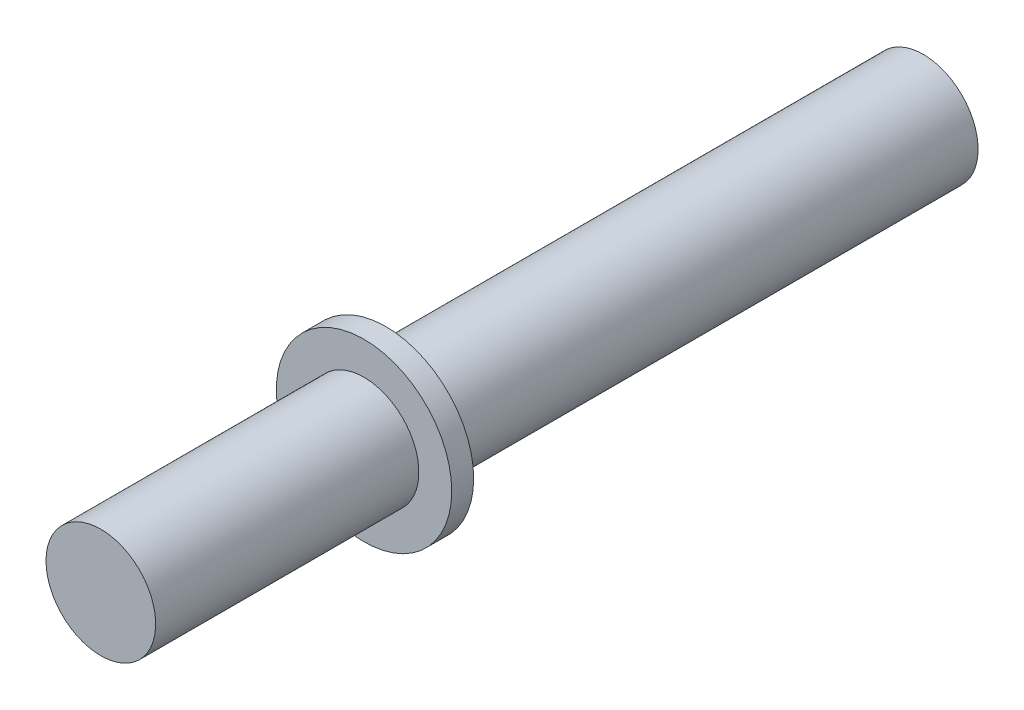
ISO-10303-21;
HEADER;
FILE_DESCRIPTION(('STEP AP214'),'2;1');
FILE_NAME('part.step','',(''),(''),'','','');
FILE_SCHEMA(('AUTOMOTIVE_DESIGN { 1 0 10303 214 1 1 1 1 }'));
ENDSEC;
DATA;
#1=APPLICATION_CONTEXT('core data for automotive mechanical design processes');
#2=APPLICATION_PROTOCOL_DEFINITION('international standard','automotive_design',2000,#1);
#3=PRODUCT_CONTEXT('',#1,'mechanical');
#4=PRODUCT('Part','Part','',(#3));
#5=PRODUCT_RELATED_PRODUCT_CATEGORY('part','',(#4));
#6=PRODUCT_DEFINITION_FORMATION('','',#4);
#7=PRODUCT_DEFINITION_CONTEXT('part definition',#1,'design');
#8=PRODUCT_DEFINITION('design','',#6,#7);
#9=PRODUCT_DEFINITION_SHAPE('','',#8);
#10=(LENGTH_UNIT() NAMED_UNIT(*) SI_UNIT(.MILLI.,.METRE.));
#11=(NAMED_UNIT(*) PLANE_ANGLE_UNIT() SI_UNIT($,.RADIAN.));
#12=(NAMED_UNIT(*) SI_UNIT($,.STERADIAN.) SOLID_ANGLE_UNIT());
#13=UNCERTAINTY_MEASURE_WITH_UNIT(LENGTH_MEASURE(1.E-05),#10,'distance_accuracy_value','');
#14=(GEOMETRIC_REPRESENTATION_CONTEXT(3) GLOBAL_UNCERTAINTY_ASSIGNED_CONTEXT((#13)) GLOBAL_UNIT_ASSIGNED_CONTEXT((#10,
#11,#12)) REPRESENTATION_CONTEXT('',''));
#15=CARTESIAN_POINT('',(0.,0.,0.));
#16=DIRECTION('',(0.,0.,1.));
#17=DIRECTION('',(1.,0.,0.));
#18=AXIS2_PLACEMENT_3D('',#15,#16,#17);
#19=CARTESIAN_POINT('',(-32.018684277368,-34.6434023405005,44.));
#20=DIRECTION('',(0.,0.,-1.));
#21=DIRECTION('',(-1.,0.,0.));
#22=AXIS2_PLACEMENT_3D('',#19,#20,#21);
#23=CYLINDRICAL_SURFACE('',#22,1.5);
#24=CARTESIAN_POINT('',(-32.018684277368,-34.6434023405005,36.8));
#25=DIRECTION('',(0.,0.,1.));
#26=DIRECTION('',(1.,0.,0.));
#27=AXIS2_PLACEMENT_3D('',#24,#25,#26);
#28=CIRCLE('',#27,1.5);
#29=CARTESIAN_POINT('',(-33.518684277368,-34.6434023405005,36.8));
#30=VERTEX_POINT('',#29);
#31=EDGE_CURVE('E39',#30,#30,#28,.T.);
#32=CARTESIAN_POINT('',(-32.018684277368,-34.6434023405005,44.));
#33=DIRECTION('',(0.,0.,1.));
#34=DIRECTION('',(1.,0.,0.));
#35=AXIS2_PLACEMENT_3D('',#32,#33,#34);
#36=CIRCLE('',#35,1.5);
#37=CARTESIAN_POINT('',(-33.518684277368,-34.6434023405005,44.));
#38=VERTEX_POINT('',#37);
#39=EDGE_CURVE('E43',#38,#38,#36,.T.);
#40=CARTESIAN_POINT('',(-33.518684277368,-34.6434023405005,36.8));
#41=CARTESIAN_POINT('',(-33.518684277368,-34.6434023405005,36.875));
#42=CARTESIAN_POINT('',(-33.518684277368,-34.6434023405005,36.95));
#43=CARTESIAN_POINT('',(-33.518684277368,-34.6434023405005,37.1));
#44=CARTESIAN_POINT('',(-33.518684277368,-34.6434023405005,37.175));
#45=CARTESIAN_POINT('',(-33.518684277368,-34.6434023405005,37.325));
#46=CARTESIAN_POINT('',(-33.518684277368,-34.6434023405005,37.4));
#47=CARTESIAN_POINT('',(-33.518684277368,-34.6434023405005,37.55));
#48=CARTESIAN_POINT('',(-33.518684277368,-34.6434023405005,37.625));
#49=CARTESIAN_POINT('',(-33.518684277368,-34.6434023405005,37.775));
#50=CARTESIAN_POINT('',(-33.518684277368,-34.6434023405005,37.85));
#51=CARTESIAN_POINT('',(-33.518684277368,-34.6434023405005,38.));
#52=CARTESIAN_POINT('',(-33.518684277368,-34.6434023405005,38.075));
#53=CARTESIAN_POINT('',(-33.518684277368,-34.6434023405005,38.225));
#54=CARTESIAN_POINT('',(-33.518684277368,-34.6434023405005,38.3));
#55=CARTESIAN_POINT('',(-33.518684277368,-34.6434023405005,38.45));
#56=CARTESIAN_POINT('',(-33.518684277368,-34.6434023405005,38.525));
#57=CARTESIAN_POINT('',(-33.518684277368,-34.6434023405005,38.675));
#58=CARTESIAN_POINT('',(-33.518684277368,-34.6434023405005,38.75));
#59=CARTESIAN_POINT('',(-33.518684277368,-34.6434023405005,38.9));
#60=CARTESIAN_POINT('',(-33.518684277368,-34.6434023405005,38.975));
#61=CARTESIAN_POINT('',(-33.518684277368,-34.6434023405005,39.125));
#62=CARTESIAN_POINT('',(-33.518684277368,-34.6434023405005,39.2));
#63=CARTESIAN_POINT('',(-33.518684277368,-34.6434023405005,39.35));
#64=CARTESIAN_POINT('',(-33.518684277368,-34.6434023405005,39.425));
#65=CARTESIAN_POINT('',(-33.518684277368,-34.6434023405005,39.575));
#66=CARTESIAN_POINT('',(-33.518684277368,-34.6434023405005,39.65));
#67=CARTESIAN_POINT('',(-33.518684277368,-34.6434023405005,39.8));
#68=CARTESIAN_POINT('',(-33.518684277368,-34.6434023405005,39.875));
#69=CARTESIAN_POINT('',(-33.518684277368,-34.6434023405005,40.025));
#70=CARTESIAN_POINT('',(-33.518684277368,-34.6434023405005,40.1));
#71=CARTESIAN_POINT('',(-33.518684277368,-34.6434023405005,40.25));
#72=CARTESIAN_POINT('',(-33.518684277368,-34.6434023405005,40.325));
#73=CARTESIAN_POINT('',(-33.518684277368,-34.6434023405005,40.475));
#74=CARTESIAN_POINT('',(-33.518684277368,-34.6434023405005,40.55));
#75=CARTESIAN_POINT('',(-33.518684277368,-34.6434023405005,40.7));
#76=CARTESIAN_POINT('',(-33.518684277368,-34.6434023405005,40.775));
#77=CARTESIAN_POINT('',(-33.518684277368,-34.6434023405005,40.925));
#78=CARTESIAN_POINT('',(-33.518684277368,-34.6434023405005,41.));
#79=CARTESIAN_POINT('',(-33.518684277368,-34.6434023405005,41.15));
#80=CARTESIAN_POINT('',(-33.518684277368,-34.6434023405005,41.225));
#81=CARTESIAN_POINT('',(-33.518684277368,-34.6434023405005,41.375));
#82=CARTESIAN_POINT('',(-33.518684277368,-34.6434023405005,41.45));
#83=CARTESIAN_POINT('',(-33.518684277368,-34.6434023405005,41.6));
#84=CARTESIAN_POINT('',(-33.518684277368,-34.6434023405005,41.675));
#85=CARTESIAN_POINT('',(-33.518684277368,-34.6434023405005,41.825));
#86=CARTESIAN_POINT('',(-33.518684277368,-34.6434023405005,41.9));
#87=CARTESIAN_POINT('',(-33.518684277368,-34.6434023405005,42.05));
#88=CARTESIAN_POINT('',(-33.518684277368,-34.6434023405005,42.125));
#89=CARTESIAN_POINT('',(-33.518684277368,-34.6434023405005,42.275));
#90=CARTESIAN_POINT('',(-33.518684277368,-34.6434023405005,42.35));
#91=CARTESIAN_POINT('',(-33.518684277368,-34.6434023405005,42.5));
#92=CARTESIAN_POINT('',(-33.518684277368,-34.6434023405005,42.575));
#93=CARTESIAN_POINT('',(-33.518684277368,-34.6434023405005,42.725));
#94=CARTESIAN_POINT('',(-33.518684277368,-34.6434023405005,42.8));
#95=CARTESIAN_POINT('',(-33.518684277368,-34.6434023405005,42.95));
#96=CARTESIAN_POINT('',(-33.518684277368,-34.6434023405005,43.025));
#97=CARTESIAN_POINT('',(-33.518684277368,-34.6434023405005,43.175));
#98=CARTESIAN_POINT('',(-33.518684277368,-34.6434023405005,43.25));
#99=CARTESIAN_POINT('',(-33.518684277368,-34.6434023405005,43.4));
#100=CARTESIAN_POINT('',(-33.518684277368,-34.6434023405005,43.475));
#101=CARTESIAN_POINT('',(-33.518684277368,-34.6434023405005,43.625));
#102=CARTESIAN_POINT('',(-33.518684277368,-34.6434023405005,43.7));
#103=CARTESIAN_POINT('',(-33.518684277368,-34.6434023405005,43.85));
#104=CARTESIAN_POINT('',(-33.518684277368,-34.6434023405005,43.925));
#105=CARTESIAN_POINT('',(-33.518684277368,-34.6434023405005,44.));
#106=B_SPLINE_CURVE_WITH_KNOTS('',3,(#40,#41,#42,#43,#44,#45,#46,#47,#48,#49,#50,#51,#52,#53,
#54,#55,#56,#57,#58,#59,#60,#61,#62,#63,#64,#65,#66,#67,#68,#69,#70,#71,#72,#73,#74,#75,#76,#77,
#78,#79,#80,#81,#82,#83,#84,#85,#86,#87,#88,#89,#90,#91,#92,#93,#94,#95,#96,#97,#98,#99,#100,
#101,#102,#103,#104,#105),.UNSPECIFIED.,.F.,.F.,(4,2,2,2,2,2,2,2,2,2,2,2,2,2,2,2,2,2,2,2,2,2,2,
2,2,2,2,2,2,2,2,2,4),(0.,0.224999999999996,0.449999999999999,0.674999999999995,
0.899999999999998,1.12499999999999,1.35,1.57499999999999,1.8,2.02499999999999,2.25,2.475,
2.69999999999999,2.92499999999999,3.14999999999999,3.375,3.59999999999999,3.82499999999999,
4.04999999999999,4.27499999999999,4.49999999999999,4.72499999999999,4.94999999999999,
5.17499999999999,5.39999999999999,5.62499999999999,5.84999999999999,6.07499999999999,
6.29999999999999,6.52499999999999,6.74999999999999,6.97499999999999,7.19999999999999),.UNSPECIFIED.);
#107=EDGE_CURVE('BSEAM36',#30,#38,#106,.T.);
#108=ORIENTED_EDGE('',*,*,#31,.T.);
#109=ORIENTED_EDGE('',*,*,#39,.F.);
#110=ORIENTED_EDGE('',*,*,#107,.T.);
#111=ORIENTED_EDGE('',*,*,#107,.F.);
#112=EDGE_LOOP('',(#108,#110,#109,#111));
#113=FACE_BOUND('',#112,.T.);
#114=ADVANCED_FACE('F36',(#113),#23,.T.);
#115=CARTESIAN_POINT('',(-32.018684277368,-34.6434023405005,44.));
#116=DIRECTION('',(0.,0.,1.));
#117=DIRECTION('',(1.,0.,0.));
#118=AXIS2_PLACEMENT_3D('',#115,#116,#117);
#119=PLANE('',#118);
#120=ORIENTED_EDGE('',*,*,#39,.T.);
#121=EDGE_LOOP('',(#120));
#122=FACE_BOUND('',#121,.T.);
#123=ADVANCED_FACE('F75',(#122),#119,.T.);
#124=CARTESIAN_POINT('',(-32.018684277368,-34.6434023405005,36.8));
#125=DIRECTION('',(0.,0.,-1.));
#126=DIRECTION('',(-1.,0.,0.));
#127=AXIS2_PLACEMENT_3D('',#124,#125,#126);
#128=CYLINDRICAL_SURFACE('',#127,2.4);
#129=CARTESIAN_POINT('',(-32.018684277368,-34.6434023405005,36.8));
#130=DIRECTION('',(0.,0.,1.));
#131=DIRECTION('',(1.,0.,0.));
#132=AXIS2_PLACEMENT_3D('',#129,#130,#131);
#133=CIRCLE('',#132,2.4);
#134=CARTESIAN_POINT('',(-29.618684277368,-34.6434023405005,36.8));
#135=VERTEX_POINT('',#134);
#136=EDGE_CURVE('E55',#135,#135,#133,.T.);
#137=ORIENTED_EDGE('',*,*,#136,.F.);
#138=EDGE_LOOP('',(#137));
#139=FACE_BOUND('',#138,.T.);
#140=CARTESIAN_POINT('',(-32.018684277368,-34.6434023405005,36.2));
#141=DIRECTION('',(0.,0.,1.));
#142=DIRECTION('',(1.,0.,0.));
#143=AXIS2_PLACEMENT_3D('',#140,#141,#142);
#144=CIRCLE('',#143,2.4);
#145=CARTESIAN_POINT('',(-29.618684277368,-34.6434023405005,36.2));
#146=VERTEX_POINT('',#145);
#147=EDGE_CURVE('E52',#146,#146,#144,.T.);
#148=ORIENTED_EDGE('',*,*,#147,.T.);
#149=EDGE_LOOP('',(#148));
#150=FACE_BOUND('',#149,.T.);
#151=ADVANCED_FACE('F67',(#139,#150),#128,.T.);
#152=CARTESIAN_POINT('',(-32.018684277368,-34.6434023405005,36.8));
#153=DIRECTION('',(0.,0.,1.));
#154=DIRECTION('',(1.,0.,0.));
#155=AXIS2_PLACEMENT_3D('',#152,#153,#154);
#156=PLANE('',#155);
#157=ORIENTED_EDGE('',*,*,#31,.F.);
#158=EDGE_LOOP('',(#157));
#159=FACE_BOUND('',#158,.T.);
#160=ORIENTED_EDGE('',*,*,#136,.T.);
#161=EDGE_LOOP('',(#160));
#162=FACE_BOUND('',#161,.T.);
#163=ADVANCED_FACE('F64',(#159,#162),#156,.T.);
#164=CARTESIAN_POINT('',(-32.018684277368,-34.6434023405005,36.2));
#165=DIRECTION('',(0.,0.,1.));
#166=DIRECTION('',(1.,0.,0.));
#167=AXIS2_PLACEMENT_3D('',#164,#165,#166);
#168=PLANE('',#167);
#169=CARTESIAN_POINT('',(-32.018684277368,-34.6434023405005,36.2));
#170=DIRECTION('',(0.,0.,1.));
#171=DIRECTION('',(1.,0.,0.));
#172=AXIS2_PLACEMENT_3D('',#169,#170,#171);
#173=CIRCLE('',#172,1.5);
#174=CARTESIAN_POINT('',(-33.518684277368,-34.6434023405005,36.2));
#175=VERTEX_POINT('',#174);
#176=EDGE_CURVE('E10',#175,#175,#173,.T.);
#177=ORIENTED_EDGE('',*,*,#176,.T.);
#178=EDGE_LOOP('',(#177));
#179=FACE_BOUND('',#178,.T.);
#180=ORIENTED_EDGE('',*,*,#147,.F.);
#181=EDGE_LOOP('',(#180));
#182=FACE_BOUND('',#181,.T.);
#183=ADVANCED_FACE('F66',(#179,#182),#168,.F.);
#184=CARTESIAN_POINT('',(-32.018684277368,-34.6434023405005,21.5));
#185=DIRECTION('',(0.,0.,1.));
#186=DIRECTION('',(1.,0.,0.));
#187=AXIS2_PLACEMENT_3D('',#184,#185,#186);
#188=PLANE('',#187);
#189=CARTESIAN_POINT('',(-32.018684277368,-34.6434023405005,21.5));
#190=DIRECTION('',(0.,0.,1.));
#191=DIRECTION('',(1.,0.,0.));
#192=AXIS2_PLACEMENT_3D('',#189,#190,#191);
#193=CIRCLE('',#192,1.5);
#194=CARTESIAN_POINT('',(-33.518684277368,-34.6434023405005,21.5));
#195=VERTEX_POINT('',#194);
#196=EDGE_CURVE('E47',#195,#195,#193,.T.);
#197=ORIENTED_EDGE('',*,*,#196,.F.);
#198=EDGE_LOOP('',(#197));
#199=FACE_BOUND('',#198,.T.);
#200=ADVANCED_FACE('F73',(#199),#188,.F.);
#201=CARTESIAN_POINT('',(-33.518684277368,-34.6434023405005,21.5));
#202=CARTESIAN_POINT('',(-33.518684277368,-34.6434023405005,21.653125));
#203=CARTESIAN_POINT('',(-33.518684277368,-34.6434023405005,21.80625));
#204=CARTESIAN_POINT('',(-33.518684277368,-34.6434023405005,22.1125));
#205=CARTESIAN_POINT('',(-33.518684277368,-34.6434023405005,22.265625));
#206=CARTESIAN_POINT('',(-33.518684277368,-34.6434023405005,22.571875));
#207=CARTESIAN_POINT('',(-33.518684277368,-34.6434023405005,22.725));
#208=CARTESIAN_POINT('',(-33.518684277368,-34.6434023405005,23.03125));
#209=CARTESIAN_POINT('',(-33.518684277368,-34.6434023405005,23.184375));
#210=CARTESIAN_POINT('',(-33.518684277368,-34.6434023405005,23.490625));
#211=CARTESIAN_POINT('',(-33.518684277368,-34.6434023405005,23.64375));
#212=CARTESIAN_POINT('',(-33.518684277368,-34.6434023405005,23.95));
#213=CARTESIAN_POINT('',(-33.518684277368,-34.6434023405005,24.103125));
#214=CARTESIAN_POINT('',(-33.518684277368,-34.6434023405005,24.409375));
#215=CARTESIAN_POINT('',(-33.518684277368,-34.6434023405005,24.5625));
#216=CARTESIAN_POINT('',(-33.518684277368,-34.6434023405005,24.86875));
#217=CARTESIAN_POINT('',(-33.518684277368,-34.6434023405005,25.021875));
#218=CARTESIAN_POINT('',(-33.518684277368,-34.6434023405005,25.328125));
#219=CARTESIAN_POINT('',(-33.518684277368,-34.6434023405005,25.48125));
#220=CARTESIAN_POINT('',(-33.518684277368,-34.6434023405005,25.7875));
#221=CARTESIAN_POINT('',(-33.518684277368,-34.6434023405005,25.940625));
#222=CARTESIAN_POINT('',(-33.518684277368,-34.6434023405005,26.246875));
#223=CARTESIAN_POINT('',(-33.518684277368,-34.6434023405005,26.4));
#224=CARTESIAN_POINT('',(-33.518684277368,-34.6434023405005,26.70625));
#225=CARTESIAN_POINT('',(-33.518684277368,-34.6434023405005,26.859375));
#226=CARTESIAN_POINT('',(-33.518684277368,-34.6434023405005,27.165625));
#227=CARTESIAN_POINT('',(-33.518684277368,-34.6434023405005,27.31875));
#228=CARTESIAN_POINT('',(-33.518684277368,-34.6434023405005,27.625));
#229=CARTESIAN_POINT('',(-33.518684277368,-34.6434023405005,27.778125));
#230=CARTESIAN_POINT('',(-33.518684277368,-34.6434023405005,28.084375));
#231=CARTESIAN_POINT('',(-33.518684277368,-34.6434023405005,28.2375));
#232=CARTESIAN_POINT('',(-33.518684277368,-34.6434023405005,28.54375));
#233=CARTESIAN_POINT('',(-33.518684277368,-34.6434023405005,28.696875));
#234=CARTESIAN_POINT('',(-33.518684277368,-34.6434023405005,29.003125));
#235=CARTESIAN_POINT('',(-33.518684277368,-34.6434023405005,29.15625));
#236=CARTESIAN_POINT('',(-33.518684277368,-34.6434023405005,29.4625));
#237=CARTESIAN_POINT('',(-33.518684277368,-34.6434023405005,29.615625));
#238=CARTESIAN_POINT('',(-33.518684277368,-34.6434023405005,29.921875));
#239=CARTESIAN_POINT('',(-33.518684277368,-34.6434023405005,30.075));
#240=CARTESIAN_POINT('',(-33.518684277368,-34.6434023405005,30.38125));
#241=CARTESIAN_POINT('',(-33.518684277368,-34.6434023405005,30.534375));
#242=CARTESIAN_POINT('',(-33.518684277368,-34.6434023405005,30.840625));
#243=CARTESIAN_POINT('',(-33.518684277368,-34.6434023405005,30.99375));
#244=CARTESIAN_POINT('',(-33.518684277368,-34.6434023405005,31.3));
#245=CARTESIAN_POINT('',(-33.518684277368,-34.6434023405005,31.453125));
#246=CARTESIAN_POINT('',(-33.518684277368,-34.6434023405005,31.759375));
#247=CARTESIAN_POINT('',(-33.518684277368,-34.6434023405005,31.9125));
#248=CARTESIAN_POINT('',(-33.518684277368,-34.6434023405005,32.21875));
#249=CARTESIAN_POINT('',(-33.518684277368,-34.6434023405005,32.371875));
#250=CARTESIAN_POINT('',(-33.518684277368,-34.6434023405005,32.678125));
#251=CARTESIAN_POINT('',(-33.518684277368,-34.6434023405005,32.83125));
#252=CARTESIAN_POINT('',(-33.518684277368,-34.6434023405005,33.1375));
#253=CARTESIAN_POINT('',(-33.518684277368,-34.6434023405005,33.290625));
#254=CARTESIAN_POINT('',(-33.518684277368,-34.6434023405005,33.596875));
#255=CARTESIAN_POINT('',(-33.518684277368,-34.6434023405005,33.75));
#256=CARTESIAN_POINT('',(-33.518684277368,-34.6434023405005,34.05625));
#257=CARTESIAN_POINT('',(-33.518684277368,-34.6434023405005,34.209375));
#258=CARTESIAN_POINT('',(-33.518684277368,-34.6434023405005,34.515625));
#259=CARTESIAN_POINT('',(-33.518684277368,-34.6434023405005,34.66875));
#260=CARTESIAN_POINT('',(-33.518684277368,-34.6434023405005,34.975));
#261=CARTESIAN_POINT('',(-33.518684277368,-34.6434023405005,35.128125));
#262=CARTESIAN_POINT('',(-33.518684277368,-34.6434023405005,35.434375));
#263=CARTESIAN_POINT('',(-33.518684277368,-34.6434023405005,35.5875));
#264=CARTESIAN_POINT('',(-33.518684277368,-34.6434023405005,35.89375));
#265=CARTESIAN_POINT('',(-33.518684277368,-34.6434023405005,36.046875));
#266=CARTESIAN_POINT('',(-33.518684277368,-34.6434023405005,36.2));
#267=B_SPLINE_CURVE_WITH_KNOTS('',3,(#201,#202,#203,#204,#205,#206,#207,#208,#209,#210,#211,
#212,#213,#214,#215,#216,#217,#218,#219,#220,#221,#222,#223,#224,#225,#226,#227,#228,#229,#230,
#231,#232,#233,#234,#235,#236,#237,#238,#239,#240,#241,#242,#243,#244,#245,#246,#247,#248,#249,
#250,#251,#252,#253,#254,#255,#256,#257,#258,#259,#260,#261,#262,#263,#264,#265,#266),
.UNSPECIFIED.,.F.,.F.,(4,2,2,2,2,2,2,2,2,2,2,2,2,2,2,2,2,2,2,2,2,2,2,2,2,2,2,2,2,2,2,2,4),(0.,
0.459375000000001,0.918749999999999,1.378125,1.8375,2.296875,2.75625,3.215625,3.675,4.134375,
4.59375,5.053125,5.5125,5.971875,6.43125,6.890625,7.35,7.809375,8.26875,8.728125,
9.18750000000001,9.646875,10.10625,10.565625,11.025,11.484375,11.94375,12.403125,12.8625,
13.321875,13.78125,14.240625,14.7),.UNSPECIFIED.);
#268=EDGE_CURVE('BSEAM79',#195,#175,#267,.T.);
#269=ORIENTED_EDGE('',*,*,#196,.T.);
#270=ORIENTED_EDGE('',*,*,#176,.F.);
#271=ORIENTED_EDGE('',*,*,#268,.T.);
#272=ORIENTED_EDGE('',*,*,#268,.F.);
#273=EDGE_LOOP('',(#269,#271,#270,#272));
#274=FACE_BOUND('',#273,.T.);
#275=ADVANCED_FACE('F79',(#274),#23,.T.);
#276=CLOSED_SHELL('',(#114,#123,#151,#163,#183,#200,#275));
#277=MANIFOLD_SOLID_BREP('B2',#276);
#278=ADVANCED_BREP_SHAPE_REPRESENTATION('',(#18,#277),#14);
#279=SHAPE_DEFINITION_REPRESENTATION(#9,#278);
ENDSEC;
END-ISO-10303-21;
